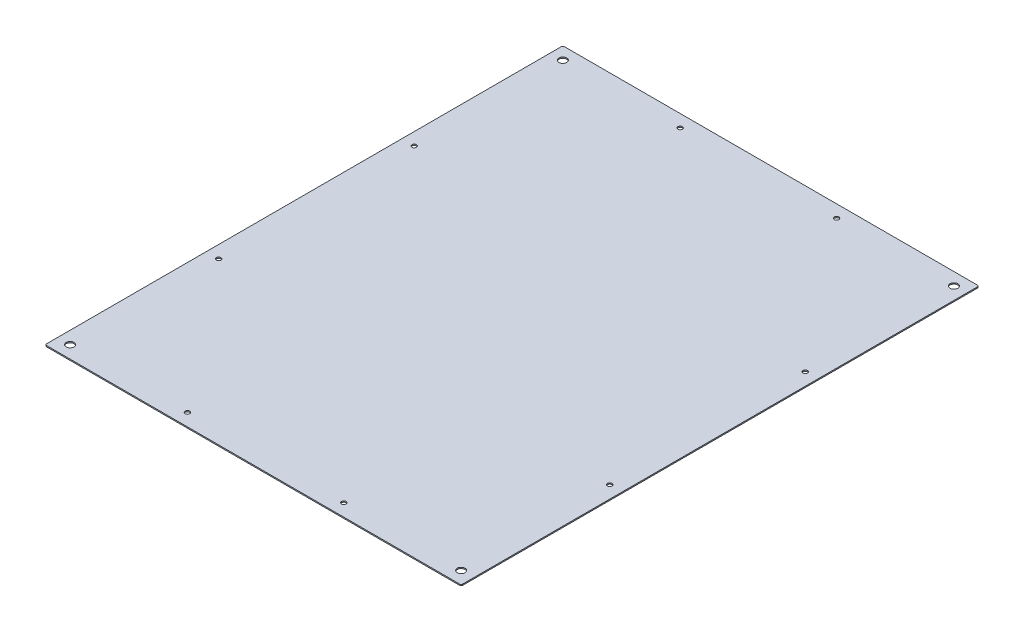
ISO-10303-21;
HEADER;
FILE_DESCRIPTION(('STEP AP214'),'2;1');
FILE_NAME('part.step','',(''),(''),'','','');
FILE_SCHEMA(('AUTOMOTIVE_DESIGN { 1 0 10303 214 1 1 1 1 }'));
ENDSEC;
DATA;
#1=APPLICATION_CONTEXT('core data for automotive mechanical design processes');
#2=APPLICATION_PROTOCOL_DEFINITION('international standard','automotive_design',2000,#1);
#3=PRODUCT_CONTEXT('',#1,'mechanical');
#4=PRODUCT('Part','Part','',(#3));
#5=PRODUCT_RELATED_PRODUCT_CATEGORY('part','',(#4));
#6=PRODUCT_DEFINITION_FORMATION('','',#4);
#7=PRODUCT_DEFINITION_CONTEXT('part definition',#1,'design');
#8=PRODUCT_DEFINITION('design','',#6,#7);
#9=PRODUCT_DEFINITION_SHAPE('','',#8);
#10=(LENGTH_UNIT() NAMED_UNIT(*) SI_UNIT(.MILLI.,.METRE.));
#11=(NAMED_UNIT(*) PLANE_ANGLE_UNIT() SI_UNIT($,.RADIAN.));
#12=(NAMED_UNIT(*) SI_UNIT($,.STERADIAN.) SOLID_ANGLE_UNIT());
#13=UNCERTAINTY_MEASURE_WITH_UNIT(LENGTH_MEASURE(1.E-05),#10,'distance_accuracy_value','');
#14=(GEOMETRIC_REPRESENTATION_CONTEXT(3) GLOBAL_UNCERTAINTY_ASSIGNED_CONTEXT((#13)) GLOBAL_UNIT_ASSIGNED_CONTEXT((#10,
#11,#12)) REPRESENTATION_CONTEXT('',''));
#15=CARTESIAN_POINT('',(0.,0.,0.));
#16=DIRECTION('',(0.,0.,1.));
#17=DIRECTION('',(1.,0.,0.));
#18=AXIS2_PLACEMENT_3D('',#15,#16,#17);
#19=CARTESIAN_POINT('',(266.,-1.5,331.));
#20=DIRECTION('',(0.,0.,1.));
#21=DIRECTION('',(1.,0.,0.));
#22=AXIS2_PLACEMENT_3D('',#19,#20,#21);
#23=PLANE('',#22);
#24=DIRECTION('',(1.,0.,0.));
#25=VECTOR('',#24,1.);
#26=CARTESIAN_POINT('',(266.,-1.5,331.));
#27=LINE('',#26,#25);
#28=CARTESIAN_POINT('',(-264.,-1.5,331.));
#29=VERTEX_POINT('',#28);
#30=CARTESIAN_POINT('',(264.,-1.5,331.));
#31=VERTEX_POINT('',#30);
#32=EDGE_CURVE('E165',#29,#31,#27,.T.);
#33=ORIENTED_EDGE('',*,*,#32,.T.);
#34=DIRECTION('',(0.,1.,0.));
#35=VECTOR('',#34,1.);
#36=CARTESIAN_POINT('',(264.,-1.5,331.));
#37=LINE('',#36,#35);
#38=CARTESIAN_POINT('',(264.,0.,331.));
#39=VERTEX_POINT('',#38);
#40=EDGE_CURVE('E11',#31,#39,#37,.T.);
#41=ORIENTED_EDGE('',*,*,#40,.T.);
#42=DIRECTION('',(1.,0.,0.));
#43=VECTOR('',#42,1.);
#44=CARTESIAN_POINT('',(266.,0.,331.));
#45=LINE('',#44,#43);
#46=CARTESIAN_POINT('',(-264.,0.,331.));
#47=VERTEX_POINT('',#46);
#48=EDGE_CURVE('E115',#47,#39,#45,.T.);
#49=ORIENTED_EDGE('',*,*,#48,.F.);
#50=DIRECTION('',(0.,1.,0.));
#51=VECTOR('',#50,1.);
#52=CARTESIAN_POINT('',(-264.,-1.5,331.));
#53=LINE('',#52,#51);
#54=EDGE_CURVE('E51',#47,#29,#53,.F.);
#55=ORIENTED_EDGE('',*,*,#54,.T.);
#56=EDGE_LOOP('',(#33,#41,#49,#55));
#57=FACE_BOUND('',#56,.T.);
#58=ADVANCED_FACE('F43',(#57),#23,.T.);
#59=CARTESIAN_POINT('',(-266.,-1.5,-331.));
#60=DIRECTION('',(-1.,0.,0.));
#61=DIRECTION('',(0.,0.,1.));
#62=AXIS2_PLACEMENT_3D('',#59,#60,#61);
#63=PLANE('',#62);
#64=DIRECTION('',(0.,0.,1.));
#65=VECTOR('',#64,1.);
#66=CARTESIAN_POINT('',(-266.,0.,-331.));
#67=LINE('',#66,#65);
#68=CARTESIAN_POINT('',(-266.,0.,-329.));
#69=VERTEX_POINT('',#68);
#70=CARTESIAN_POINT('',(-266.,0.,329.));
#71=VERTEX_POINT('',#70);
#72=EDGE_CURVE('E141',#69,#71,#67,.T.);
#73=ORIENTED_EDGE('',*,*,#72,.F.);
#74=DIRECTION('',(0.,1.,0.));
#75=VECTOR('',#74,1.);
#76=CARTESIAN_POINT('',(-266.,-1.5,-329.));
#77=LINE('',#76,#75);
#78=CARTESIAN_POINT('',(-266.,-1.5,-329.));
#79=VERTEX_POINT('',#78);
#80=EDGE_CURVE('E65',#69,#79,#77,.F.);
#81=ORIENTED_EDGE('',*,*,#80,.T.);
#82=DIRECTION('',(0.,0.,1.));
#83=VECTOR('',#82,1.);
#84=CARTESIAN_POINT('',(-266.,-1.5,-331.));
#85=LINE('',#84,#83);
#86=CARTESIAN_POINT('',(-266.,-1.5,329.));
#87=VERTEX_POINT('',#86);
#88=EDGE_CURVE('E135',#79,#87,#85,.T.);
#89=ORIENTED_EDGE('',*,*,#88,.T.);
#90=DIRECTION('',(0.,1.,0.));
#91=VECTOR('',#90,1.);
#92=CARTESIAN_POINT('',(-266.,-1.5,329.));
#93=LINE('',#92,#91);
#94=EDGE_CURVE('E159',#87,#71,#93,.T.);
#95=ORIENTED_EDGE('',*,*,#94,.T.);
#96=EDGE_LOOP('',(#73,#81,#89,#95));
#97=FACE_BOUND('',#96,.T.);
#98=ADVANCED_FACE('F173',(#97),#63,.T.);
#99=CARTESIAN_POINT('',(266.,-1.5,-331.));
#100=DIRECTION('',(0.,0.,-1.));
#101=DIRECTION('',(-1.,0.,0.));
#102=AXIS2_PLACEMENT_3D('',#99,#100,#101);
#103=PLANE('',#102);
#104=DIRECTION('',(-1.,0.,0.));
#105=VECTOR('',#104,1.);
#106=CARTESIAN_POINT('',(266.,0.,-331.));
#107=LINE('',#106,#105);
#108=CARTESIAN_POINT('',(264.,0.,-331.));
#109=VERTEX_POINT('',#108);
#110=CARTESIAN_POINT('',(-264.,0.,-331.));
#111=VERTEX_POINT('',#110);
#112=EDGE_CURVE('E130',#109,#111,#107,.T.);
#113=ORIENTED_EDGE('',*,*,#112,.F.);
#114=DIRECTION('',(0.,1.,0.));
#115=VECTOR('',#114,1.);
#116=CARTESIAN_POINT('',(264.,-1.5,-331.));
#117=LINE('',#116,#115);
#118=CARTESIAN_POINT('',(264.,-1.5,-331.));
#119=VERTEX_POINT('',#118);
#120=EDGE_CURVE('E151',#109,#119,#117,.F.);
#121=ORIENTED_EDGE('',*,*,#120,.T.);
#122=DIRECTION('',(-1.,0.,0.));
#123=VECTOR('',#122,1.);
#124=CARTESIAN_POINT('',(266.,-1.5,-331.));
#125=LINE('',#124,#123);
#126=CARTESIAN_POINT('',(-264.,-1.5,-331.));
#127=VERTEX_POINT('',#126);
#128=EDGE_CURVE('E138',#119,#127,#125,.T.);
#129=ORIENTED_EDGE('',*,*,#128,.T.);
#130=DIRECTION('',(0.,1.,0.));
#131=VECTOR('',#130,1.);
#132=CARTESIAN_POINT('',(-264.,-1.5,-331.));
#133=LINE('',#132,#131);
#134=EDGE_CURVE('E148',#127,#111,#133,.T.);
#135=ORIENTED_EDGE('',*,*,#134,.T.);
#136=EDGE_LOOP('',(#113,#121,#129,#135));
#137=FACE_BOUND('',#136,.T.);
#138=ADVANCED_FACE('F301',(#137),#103,.T.);
#139=CARTESIAN_POINT('',(266.,-1.5,-331.));
#140=DIRECTION('',(1.,0.,0.));
#141=DIRECTION('',(0.,0.,-1.));
#142=AXIS2_PLACEMENT_3D('',#139,#140,#141);
#143=PLANE('',#142);
#144=DIRECTION('',(0.,0.,-1.));
#145=VECTOR('',#144,1.);
#146=CARTESIAN_POINT('',(266.,-1.5,-331.));
#147=LINE('',#146,#145);
#148=CARTESIAN_POINT('',(266.,-1.5,329.));
#149=VERTEX_POINT('',#148);
#150=CARTESIAN_POINT('',(266.,-1.5,-329.));
#151=VERTEX_POINT('',#150);
#152=EDGE_CURVE('E169',#149,#151,#147,.T.);
#153=ORIENTED_EDGE('',*,*,#152,.T.);
#154=DIRECTION('',(0.,1.,0.));
#155=VECTOR('',#154,1.);
#156=CARTESIAN_POINT('',(266.,-1.5,-329.));
#157=LINE('',#156,#155);
#158=CARTESIAN_POINT('',(266.,0.,-329.));
#159=VERTEX_POINT('',#158);
#160=EDGE_CURVE('E129',#151,#159,#157,.T.);
#161=ORIENTED_EDGE('',*,*,#160,.T.);
#162=DIRECTION('',(0.,0.,-1.));
#163=VECTOR('',#162,1.);
#164=CARTESIAN_POINT('',(266.,0.,-331.));
#165=LINE('',#164,#163);
#166=CARTESIAN_POINT('',(266.,0.,329.));
#167=VERTEX_POINT('',#166);
#168=EDGE_CURVE('E113',#167,#159,#165,.T.);
#169=ORIENTED_EDGE('',*,*,#168,.F.);
#170=DIRECTION('',(0.,1.,0.));
#171=VECTOR('',#170,1.);
#172=CARTESIAN_POINT('',(266.,-1.5,329.));
#173=LINE('',#172,#171);
#174=EDGE_CURVE('E126',#167,#149,#173,.F.);
#175=ORIENTED_EDGE('',*,*,#174,.T.);
#176=EDGE_LOOP('',(#153,#161,#169,#175));
#177=FACE_BOUND('',#176,.T.);
#178=ADVANCED_FACE('F125',(#177),#143,.T.);
#179=CARTESIAN_POINT('',(0.,-1.5,0.));
#180=DIRECTION('',(0.,1.,0.));
#181=DIRECTION('',(0.,0.,1.));
#182=AXIS2_PLACEMENT_3D('',#179,#180,#181);
#183=PLANE('',#182);
#184=CARTESIAN_POINT('',(-100.,-1.5,-315.));
#185=DIRECTION('',(0.,1.,0.));
#186=DIRECTION('',(0.,0.,1.));
#187=AXIS2_PLACEMENT_3D('',#184,#185,#186);
#188=CIRCLE('',#187,2.9);
#189=CARTESIAN_POINT('',(-100.,-1.5,-312.1));
#190=VERTEX_POINT('',#189);
#191=EDGE_CURVE('E247',#190,#190,#188,.T.);
#192=ORIENTED_EDGE('',*,*,#191,.T.);
#193=EDGE_LOOP('',(#192));
#194=FACE_BOUND('',#193,.T.);
#195=CARTESIAN_POINT('',(-250.,-1.5,-125.));
#196=DIRECTION('',(0.,1.,0.));
#197=DIRECTION('',(0.,0.,1.));
#198=AXIS2_PLACEMENT_3D('',#195,#196,#197);
#199=CIRCLE('',#198,2.90000000000001);
#200=CARTESIAN_POINT('',(-250.,-1.5,-122.1));
#201=VERTEX_POINT('',#200);
#202=EDGE_CURVE('E241',#201,#201,#199,.T.);
#203=ORIENTED_EDGE('',*,*,#202,.T.);
#204=EDGE_LOOP('',(#203));
#205=FACE_BOUND('',#204,.T.);
#206=CARTESIAN_POINT('',(-250.,-1.5,125.));
#207=DIRECTION('',(0.,1.,0.));
#208=DIRECTION('',(0.,0.,1.));
#209=AXIS2_PLACEMENT_3D('',#206,#207,#208);
#210=CIRCLE('',#209,2.90000000000001);
#211=CARTESIAN_POINT('',(-250.,-1.5,127.9));
#212=VERTEX_POINT('',#211);
#213=EDGE_CURVE('E235',#212,#212,#210,.T.);
#214=ORIENTED_EDGE('',*,*,#213,.T.);
#215=EDGE_LOOP('',(#214));
#216=FACE_BOUND('',#215,.T.);
#217=CARTESIAN_POINT('',(-99.9999999999999,-1.5,315.));
#218=DIRECTION('',(0.,1.,0.));
#219=DIRECTION('',(0.,0.,1.));
#220=AXIS2_PLACEMENT_3D('',#217,#218,#219);
#221=CIRCLE('',#220,2.9);
#222=CARTESIAN_POINT('',(-99.9999999999999,-1.5,317.9));
#223=VERTEX_POINT('',#222);
#224=EDGE_CURVE('E229',#223,#223,#221,.T.);
#225=ORIENTED_EDGE('',*,*,#224,.T.);
#226=EDGE_LOOP('',(#225));
#227=FACE_BOUND('',#226,.T.);
#228=CARTESIAN_POINT('',(99.9999999999999,-1.5,315.));
#229=DIRECTION('',(0.,1.,0.));
#230=DIRECTION('',(0.,0.,1.));
#231=AXIS2_PLACEMENT_3D('',#228,#229,#230);
#232=CIRCLE('',#231,2.9);
#233=CARTESIAN_POINT('',(99.9999999999999,-1.5,317.9));
#234=VERTEX_POINT('',#233);
#235=EDGE_CURVE('E223',#234,#234,#232,.T.);
#236=ORIENTED_EDGE('',*,*,#235,.T.);
#237=EDGE_LOOP('',(#236));
#238=FACE_BOUND('',#237,.T.);
#239=CARTESIAN_POINT('',(250.,-1.5,125.));
#240=DIRECTION('',(0.,1.,0.));
#241=DIRECTION('',(0.,0.,1.));
#242=AXIS2_PLACEMENT_3D('',#239,#240,#241);
#243=CIRCLE('',#242,2.90000000000001);
#244=CARTESIAN_POINT('',(250.,-1.5,127.9));
#245=VERTEX_POINT('',#244);
#246=EDGE_CURVE('E217',#245,#245,#243,.T.);
#247=ORIENTED_EDGE('',*,*,#246,.T.);
#248=EDGE_LOOP('',(#247));
#249=FACE_BOUND('',#248,.T.);
#250=CARTESIAN_POINT('',(250.,-1.5,-125.));
#251=DIRECTION('',(0.,1.,0.));
#252=DIRECTION('',(0.,0.,1.));
#253=AXIS2_PLACEMENT_3D('',#250,#251,#252);
#254=CIRCLE('',#253,2.90000000000001);
#255=CARTESIAN_POINT('',(250.,-1.5,-122.1));
#256=VERTEX_POINT('',#255);
#257=EDGE_CURVE('E211',#256,#256,#254,.T.);
#258=ORIENTED_EDGE('',*,*,#257,.T.);
#259=EDGE_LOOP('',(#258));
#260=FACE_BOUND('',#259,.T.);
#261=CARTESIAN_POINT('',(100.,-1.5,-315.));
#262=DIRECTION('',(0.,1.,0.));
#263=DIRECTION('',(0.,0.,1.));
#264=AXIS2_PLACEMENT_3D('',#261,#262,#263);
#265=CIRCLE('',#264,2.9);
#266=CARTESIAN_POINT('',(100.,-1.5,-312.1));
#267=VERTEX_POINT('',#266);
#268=EDGE_CURVE('E205',#267,#267,#265,.T.);
#269=ORIENTED_EDGE('',*,*,#268,.T.);
#270=EDGE_LOOP('',(#269));
#271=FACE_BOUND('',#270,.T.);
#272=CARTESIAN_POINT('',(-250.,-1.5,315.));
#273=DIRECTION('',(0.,1.,0.));
#274=DIRECTION('',(0.,0.,1.));
#275=AXIS2_PLACEMENT_3D('',#272,#273,#274);
#276=CIRCLE('',#275,4.99999999999999);
#277=CARTESIAN_POINT('',(-250.,-1.5,320.));
#278=VERTEX_POINT('',#277);
#279=EDGE_CURVE('E199',#278,#278,#276,.T.);
#280=ORIENTED_EDGE('',*,*,#279,.T.);
#281=EDGE_LOOP('',(#280));
#282=FACE_BOUND('',#281,.T.);
#283=CARTESIAN_POINT('',(250.,-1.5,315.));
#284=DIRECTION('',(0.,1.,0.));
#285=DIRECTION('',(0.,0.,1.));
#286=AXIS2_PLACEMENT_3D('',#283,#284,#285);
#287=CIRCLE('',#286,5.);
#288=CARTESIAN_POINT('',(250.,-1.5,320.));
#289=VERTEX_POINT('',#288);
#290=EDGE_CURVE('E193',#289,#289,#287,.T.);
#291=ORIENTED_EDGE('',*,*,#290,.T.);
#292=EDGE_LOOP('',(#291));
#293=FACE_BOUND('',#292,.T.);
#294=CARTESIAN_POINT('',(250.,-1.5,-315.));
#295=DIRECTION('',(0.,1.,0.));
#296=DIRECTION('',(0.,0.,1.));
#297=AXIS2_PLACEMENT_3D('',#294,#295,#296);
#298=CIRCLE('',#297,5.);
#299=CARTESIAN_POINT('',(250.,-1.5,-310.));
#300=VERTEX_POINT('',#299);
#301=EDGE_CURVE('E187',#300,#300,#298,.T.);
#302=ORIENTED_EDGE('',*,*,#301,.T.);
#303=EDGE_LOOP('',(#302));
#304=FACE_BOUND('',#303,.T.);
#305=CARTESIAN_POINT('',(-250.,-1.5,-315.));
#306=DIRECTION('',(0.,1.,0.));
#307=DIRECTION('',(0.,0.,1.));
#308=AXIS2_PLACEMENT_3D('',#305,#306,#307);
#309=CIRCLE('',#308,4.99999999999999);
#310=CARTESIAN_POINT('',(-250.,-1.5,-310.));
#311=VERTEX_POINT('',#310);
#312=EDGE_CURVE('E177',#311,#311,#309,.T.);
#313=ORIENTED_EDGE('',*,*,#312,.T.);
#314=EDGE_LOOP('',(#313));
#315=FACE_BOUND('',#314,.T.);
#316=ORIENTED_EDGE('',*,*,#128,.F.);
#317=CARTESIAN_POINT('',(264.,-1.5,-329.));
#318=DIRECTION('',(0.,1.,0.));
#319=DIRECTION('',(0.,0.,1.));
#320=AXIS2_PLACEMENT_3D('',#317,#318,#319);
#321=CIRCLE('',#320,2.);
#322=EDGE_CURVE('E157',#119,#151,#321,.F.);
#323=ORIENTED_EDGE('',*,*,#322,.T.);
#324=ORIENTED_EDGE('',*,*,#152,.F.);
#325=CARTESIAN_POINT('',(264.,-1.5,329.));
#326=DIRECTION('',(0.,1.,0.));
#327=DIRECTION('',(0.,0.,1.));
#328=AXIS2_PLACEMENT_3D('',#325,#326,#327);
#329=CIRCLE('',#328,2.);
#330=EDGE_CURVE('E134',#149,#31,#329,.F.);
#331=ORIENTED_EDGE('',*,*,#330,.T.);
#332=ORIENTED_EDGE('',*,*,#32,.F.);
#333=CARTESIAN_POINT('',(-264.,-1.5,329.));
#334=DIRECTION('',(0.,1.,0.));
#335=DIRECTION('',(0.,0.,1.));
#336=AXIS2_PLACEMENT_3D('',#333,#334,#335);
#337=CIRCLE('',#336,2.);
#338=EDGE_CURVE('E58',#29,#87,#337,.F.);
#339=ORIENTED_EDGE('',*,*,#338,.T.);
#340=ORIENTED_EDGE('',*,*,#88,.F.);
#341=CARTESIAN_POINT('',(-264.,-1.5,-329.));
#342=DIRECTION('',(0.,1.,0.));
#343=DIRECTION('',(0.,0.,1.));
#344=AXIS2_PLACEMENT_3D('',#341,#342,#343);
#345=CIRCLE('',#344,2.);
#346=EDGE_CURVE('E155',#79,#127,#345,.F.);
#347=ORIENTED_EDGE('',*,*,#346,.T.);
#348=EDGE_LOOP('',(#316,#323,#324,#331,#332,#339,#340,#347));
#349=FACE_BOUND('',#348,.T.);
#350=ADVANCED_FACE('F168',(#194,#205,#216,#227,#238,#249,#260,#271,#282,#293,#304,#315,#349),
#183,.F.);
#351=CARTESIAN_POINT('',(0.,0.,0.));
#352=DIRECTION('',(0.,1.,0.));
#353=DIRECTION('',(0.,0.,1.));
#354=AXIS2_PLACEMENT_3D('',#351,#352,#353);
#355=PLANE('',#354);
#356=CARTESIAN_POINT('',(-100.,0.,-315.));
#357=DIRECTION('',(0.,1.,0.));
#358=DIRECTION('',(0.,0.,1.));
#359=AXIS2_PLACEMENT_3D('',#356,#357,#358);
#360=CIRCLE('',#359,2.9);
#361=CARTESIAN_POINT('',(-100.,0.,-312.1));
#362=VERTEX_POINT('',#361);
#363=EDGE_CURVE('E250',#362,#362,#360,.T.);
#364=ORIENTED_EDGE('',*,*,#363,.F.);
#365=EDGE_LOOP('',(#364));
#366=FACE_BOUND('',#365,.T.);
#367=CARTESIAN_POINT('',(-250.,0.,-125.));
#368=DIRECTION('',(0.,1.,0.));
#369=DIRECTION('',(0.,0.,1.));
#370=AXIS2_PLACEMENT_3D('',#367,#368,#369);
#371=CIRCLE('',#370,2.90000000000001);
#372=CARTESIAN_POINT('',(-250.,0.,-122.1));
#373=VERTEX_POINT('',#372);
#374=EDGE_CURVE('E244',#373,#373,#371,.T.);
#375=ORIENTED_EDGE('',*,*,#374,.F.);
#376=EDGE_LOOP('',(#375));
#377=FACE_BOUND('',#376,.T.);
#378=CARTESIAN_POINT('',(-250.,0.,125.));
#379=DIRECTION('',(0.,1.,0.));
#380=DIRECTION('',(0.,0.,1.));
#381=AXIS2_PLACEMENT_3D('',#378,#379,#380);
#382=CIRCLE('',#381,2.90000000000001);
#383=CARTESIAN_POINT('',(-250.,0.,127.9));
#384=VERTEX_POINT('',#383);
#385=EDGE_CURVE('E238',#384,#384,#382,.T.);
#386=ORIENTED_EDGE('',*,*,#385,.F.);
#387=EDGE_LOOP('',(#386));
#388=FACE_BOUND('',#387,.T.);
#389=CARTESIAN_POINT('',(-99.9999999999999,0.,315.));
#390=DIRECTION('',(0.,1.,0.));
#391=DIRECTION('',(0.,0.,1.));
#392=AXIS2_PLACEMENT_3D('',#389,#390,#391);
#393=CIRCLE('',#392,2.9);
#394=CARTESIAN_POINT('',(-99.9999999999999,0.,317.9));
#395=VERTEX_POINT('',#394);
#396=EDGE_CURVE('E232',#395,#395,#393,.T.);
#397=ORIENTED_EDGE('',*,*,#396,.F.);
#398=EDGE_LOOP('',(#397));
#399=FACE_BOUND('',#398,.T.);
#400=CARTESIAN_POINT('',(99.9999999999999,0.,315.));
#401=DIRECTION('',(0.,1.,0.));
#402=DIRECTION('',(0.,0.,1.));
#403=AXIS2_PLACEMENT_3D('',#400,#401,#402);
#404=CIRCLE('',#403,2.9);
#405=CARTESIAN_POINT('',(99.9999999999999,0.,317.9));
#406=VERTEX_POINT('',#405);
#407=EDGE_CURVE('E226',#406,#406,#404,.T.);
#408=ORIENTED_EDGE('',*,*,#407,.F.);
#409=EDGE_LOOP('',(#408));
#410=FACE_BOUND('',#409,.T.);
#411=CARTESIAN_POINT('',(250.,0.,125.));
#412=DIRECTION('',(0.,1.,0.));
#413=DIRECTION('',(0.,0.,1.));
#414=AXIS2_PLACEMENT_3D('',#411,#412,#413);
#415=CIRCLE('',#414,2.90000000000001);
#416=CARTESIAN_POINT('',(250.,0.,127.9));
#417=VERTEX_POINT('',#416);
#418=EDGE_CURVE('E220',#417,#417,#415,.T.);
#419=ORIENTED_EDGE('',*,*,#418,.F.);
#420=EDGE_LOOP('',(#419));
#421=FACE_BOUND('',#420,.T.);
#422=CARTESIAN_POINT('',(250.,0.,-125.));
#423=DIRECTION('',(0.,1.,0.));
#424=DIRECTION('',(0.,0.,1.));
#425=AXIS2_PLACEMENT_3D('',#422,#423,#424);
#426=CIRCLE('',#425,2.90000000000001);
#427=CARTESIAN_POINT('',(250.,0.,-122.1));
#428=VERTEX_POINT('',#427);
#429=EDGE_CURVE('E214',#428,#428,#426,.T.);
#430=ORIENTED_EDGE('',*,*,#429,.F.);
#431=EDGE_LOOP('',(#430));
#432=FACE_BOUND('',#431,.T.);
#433=CARTESIAN_POINT('',(100.,0.,-315.));
#434=DIRECTION('',(0.,1.,0.));
#435=DIRECTION('',(0.,0.,1.));
#436=AXIS2_PLACEMENT_3D('',#433,#434,#435);
#437=CIRCLE('',#436,2.9);
#438=CARTESIAN_POINT('',(100.,0.,-312.1));
#439=VERTEX_POINT('',#438);
#440=EDGE_CURVE('E208',#439,#439,#437,.T.);
#441=ORIENTED_EDGE('',*,*,#440,.F.);
#442=EDGE_LOOP('',(#441));
#443=FACE_BOUND('',#442,.T.);
#444=CARTESIAN_POINT('',(-250.,0.,315.));
#445=DIRECTION('',(0.,1.,0.));
#446=DIRECTION('',(0.,0.,1.));
#447=AXIS2_PLACEMENT_3D('',#444,#445,#446);
#448=CIRCLE('',#447,4.99999999999998);
#449=CARTESIAN_POINT('',(-250.,0.,320.));
#450=VERTEX_POINT('',#449);
#451=EDGE_CURVE('E202',#450,#450,#448,.T.);
#452=ORIENTED_EDGE('',*,*,#451,.F.);
#453=EDGE_LOOP('',(#452));
#454=FACE_BOUND('',#453,.T.);
#455=CARTESIAN_POINT('',(250.,0.,315.));
#456=DIRECTION('',(0.,1.,0.));
#457=DIRECTION('',(0.,0.,1.));
#458=AXIS2_PLACEMENT_3D('',#455,#456,#457);
#459=CIRCLE('',#458,5.);
#460=CARTESIAN_POINT('',(250.,0.,320.));
#461=VERTEX_POINT('',#460);
#462=EDGE_CURVE('E196',#461,#461,#459,.T.);
#463=ORIENTED_EDGE('',*,*,#462,.F.);
#464=EDGE_LOOP('',(#463));
#465=FACE_BOUND('',#464,.T.);
#466=CARTESIAN_POINT('',(250.,0.,-315.));
#467=DIRECTION('',(0.,1.,0.));
#468=DIRECTION('',(0.,0.,1.));
#469=AXIS2_PLACEMENT_3D('',#466,#467,#468);
#470=CIRCLE('',#469,5.);
#471=CARTESIAN_POINT('',(250.,0.,-310.));
#472=VERTEX_POINT('',#471);
#473=EDGE_CURVE('E190',#472,#472,#470,.T.);
#474=ORIENTED_EDGE('',*,*,#473,.F.);
#475=EDGE_LOOP('',(#474));
#476=FACE_BOUND('',#475,.T.);
#477=CARTESIAN_POINT('',(-250.,0.,-315.));
#478=DIRECTION('',(0.,1.,0.));
#479=DIRECTION('',(0.,0.,1.));
#480=AXIS2_PLACEMENT_3D('',#477,#478,#479);
#481=CIRCLE('',#480,4.99999999999998);
#482=CARTESIAN_POINT('',(-250.,0.,-310.));
#483=VERTEX_POINT('',#482);
#484=EDGE_CURVE('E184',#483,#483,#481,.T.);
#485=ORIENTED_EDGE('',*,*,#484,.F.);
#486=EDGE_LOOP('',(#485));
#487=FACE_BOUND('',#486,.T.);
#488=ORIENTED_EDGE('',*,*,#168,.T.);
#489=CARTESIAN_POINT('',(264.,0.,-329.));
#490=DIRECTION('',(0.,1.,0.));
#491=DIRECTION('',(0.,0.,1.));
#492=AXIS2_PLACEMENT_3D('',#489,#490,#491);
#493=CIRCLE('',#492,2.);
#494=EDGE_CURVE('E146',#159,#109,#493,.T.);
#495=ORIENTED_EDGE('',*,*,#494,.T.);
#496=ORIENTED_EDGE('',*,*,#112,.T.);
#497=CARTESIAN_POINT('',(-264.,0.,-329.));
#498=DIRECTION('',(0.,1.,0.));
#499=DIRECTION('',(0.,0.,1.));
#500=AXIS2_PLACEMENT_3D('',#497,#498,#499);
#501=CIRCLE('',#500,2.);
#502=EDGE_CURVE('E119',#111,#69,#501,.T.);
#503=ORIENTED_EDGE('',*,*,#502,.T.);
#504=ORIENTED_EDGE('',*,*,#72,.T.);
#505=CARTESIAN_POINT('',(-264.,0.,329.));
#506=DIRECTION('',(0.,1.,0.));
#507=DIRECTION('',(0.,0.,1.));
#508=AXIS2_PLACEMENT_3D('',#505,#506,#507);
#509=CIRCLE('',#508,2.);
#510=EDGE_CURVE('E120',#71,#47,#509,.T.);
#511=ORIENTED_EDGE('',*,*,#510,.T.);
#512=ORIENTED_EDGE('',*,*,#48,.T.);
#513=CARTESIAN_POINT('',(264.,0.,329.));
#514=DIRECTION('',(0.,1.,0.));
#515=DIRECTION('',(0.,0.,1.));
#516=AXIS2_PLACEMENT_3D('',#513,#514,#515);
#517=CIRCLE('',#516,2.);
#518=EDGE_CURVE('E110',#39,#167,#517,.T.);
#519=ORIENTED_EDGE('',*,*,#518,.T.);
#520=EDGE_LOOP('',(#488,#495,#496,#503,#504,#511,#512,#519));
#521=FACE_BOUND('',#520,.T.);
#522=ADVANCED_FACE('F112',(#366,#377,#388,#399,#410,#421,#432,#443,#454,#465,#476,#487,#521),
#355,.T.);
#523=CARTESIAN_POINT('',(264.,-1.5,-329.));
#524=DIRECTION('',(0.,1.,0.));
#525=DIRECTION('',(0.,0.,1.));
#526=AXIS2_PLACEMENT_3D('',#523,#524,#525);
#527=CYLINDRICAL_SURFACE('',#526,2.);
#528=ORIENTED_EDGE('',*,*,#322,.F.);
#529=ORIENTED_EDGE('',*,*,#120,.F.);
#530=ORIENTED_EDGE('',*,*,#494,.F.);
#531=ORIENTED_EDGE('',*,*,#160,.F.);
#532=EDGE_LOOP('',(#528,#529,#530,#531));
#533=FACE_BOUND('',#532,.T.);
#534=ADVANCED_FACE('F258',(#533),#527,.T.);
#535=CARTESIAN_POINT('',(-264.,-1.5,-329.));
#536=DIRECTION('',(0.,1.,0.));
#537=DIRECTION('',(0.,0.,1.));
#538=AXIS2_PLACEMENT_3D('',#535,#536,#537);
#539=CYLINDRICAL_SURFACE('',#538,2.);
#540=ORIENTED_EDGE('',*,*,#346,.F.);
#541=ORIENTED_EDGE('',*,*,#80,.F.);
#542=ORIENTED_EDGE('',*,*,#502,.F.);
#543=ORIENTED_EDGE('',*,*,#134,.F.);
#544=EDGE_LOOP('',(#540,#541,#542,#543));
#545=FACE_BOUND('',#544,.T.);
#546=ADVANCED_FACE('F308',(#545),#539,.T.);
#547=CARTESIAN_POINT('',(264.,-1.5,329.));
#548=DIRECTION('',(0.,1.,0.));
#549=DIRECTION('',(0.,0.,1.));
#550=AXIS2_PLACEMENT_3D('',#547,#548,#549);
#551=CYLINDRICAL_SURFACE('',#550,2.);
#552=ORIENTED_EDGE('',*,*,#330,.F.);
#553=ORIENTED_EDGE('',*,*,#174,.F.);
#554=ORIENTED_EDGE('',*,*,#518,.F.);
#555=ORIENTED_EDGE('',*,*,#40,.F.);
#556=EDGE_LOOP('',(#552,#553,#554,#555));
#557=FACE_BOUND('',#556,.T.);
#558=ADVANCED_FACE('F133',(#557),#551,.T.);
#559=CARTESIAN_POINT('',(-264.,-1.5,329.));
#560=DIRECTION('',(0.,1.,0.));
#561=DIRECTION('',(0.,0.,1.));
#562=AXIS2_PLACEMENT_3D('',#559,#560,#561);
#563=CYLINDRICAL_SURFACE('',#562,2.);
#564=ORIENTED_EDGE('',*,*,#338,.F.);
#565=ORIENTED_EDGE('',*,*,#54,.F.);
#566=ORIENTED_EDGE('',*,*,#510,.F.);
#567=ORIENTED_EDGE('',*,*,#94,.F.);
#568=EDGE_LOOP('',(#564,#565,#566,#567));
#569=FACE_BOUND('',#568,.T.);
#570=ADVANCED_FACE('F45',(#569),#563,.T.);
#571=CARTESIAN_POINT('',(-250.,0.,-315.));
#572=DIRECTION('',(0.,1.,0.));
#573=DIRECTION('',(0.,0.,1.));
#574=AXIS2_PLACEMENT_3D('',#571,#572,#573);
#575=CYLINDRICAL_SURFACE('',#574,4.99999999999999);
#576=ORIENTED_EDGE('',*,*,#312,.F.);
#577=EDGE_LOOP('',(#576));
#578=FACE_BOUND('',#577,.T.);
#579=ORIENTED_EDGE('',*,*,#484,.T.);
#580=EDGE_LOOP('',(#579));
#581=FACE_BOUND('',#580,.T.);
#582=ADVANCED_FACE('F282',(#578,#581),#575,.F.);
#583=CARTESIAN_POINT('',(250.,0.,-315.));
#584=DIRECTION('',(0.,1.,0.));
#585=DIRECTION('',(0.,0.,1.));
#586=AXIS2_PLACEMENT_3D('',#583,#584,#585);
#587=CYLINDRICAL_SURFACE('',#586,5.);
#588=ORIENTED_EDGE('',*,*,#301,.F.);
#589=EDGE_LOOP('',(#588));
#590=FACE_BOUND('',#589,.T.);
#591=ORIENTED_EDGE('',*,*,#473,.T.);
#592=EDGE_LOOP('',(#591));
#593=FACE_BOUND('',#592,.T.);
#594=ADVANCED_FACE('F284',(#590,#593),#587,.F.);
#595=CARTESIAN_POINT('',(250.,0.,315.));
#596=DIRECTION('',(0.,1.,0.));
#597=DIRECTION('',(0.,0.,1.));
#598=AXIS2_PLACEMENT_3D('',#595,#596,#597);
#599=CYLINDRICAL_SURFACE('',#598,5.);
#600=ORIENTED_EDGE('',*,*,#290,.F.);
#601=EDGE_LOOP('',(#600));
#602=FACE_BOUND('',#601,.T.);
#603=ORIENTED_EDGE('',*,*,#462,.T.);
#604=EDGE_LOOP('',(#603));
#605=FACE_BOUND('',#604,.T.);
#606=ADVANCED_FACE('F291',(#602,#605),#599,.F.);
#607=CARTESIAN_POINT('',(-250.,0.,315.));
#608=DIRECTION('',(0.,1.,0.));
#609=DIRECTION('',(0.,0.,1.));
#610=AXIS2_PLACEMENT_3D('',#607,#608,#609);
#611=CYLINDRICAL_SURFACE('',#610,4.99999999999999);
#612=ORIENTED_EDGE('',*,*,#279,.F.);
#613=EDGE_LOOP('',(#612));
#614=FACE_BOUND('',#613,.T.);
#615=ORIENTED_EDGE('',*,*,#451,.T.);
#616=EDGE_LOOP('',(#615));
#617=FACE_BOUND('',#616,.T.);
#618=ADVANCED_FACE('F343',(#614,#617),#611,.F.);
#619=CARTESIAN_POINT('',(100.,0.,-315.));
#620=DIRECTION('',(0.,1.,0.));
#621=DIRECTION('',(0.,0.,1.));
#622=AXIS2_PLACEMENT_3D('',#619,#620,#621);
#623=CYLINDRICAL_SURFACE('',#622,2.9);
#624=ORIENTED_EDGE('',*,*,#268,.F.);
#625=EDGE_LOOP('',(#624));
#626=FACE_BOUND('',#625,.T.);
#627=ORIENTED_EDGE('',*,*,#440,.T.);
#628=EDGE_LOOP('',(#627));
#629=FACE_BOUND('',#628,.T.);
#630=ADVANCED_FACE('F354',(#626,#629),#623,.F.);
#631=CARTESIAN_POINT('',(250.,0.,-125.));
#632=DIRECTION('',(0.,1.,0.));
#633=DIRECTION('',(0.,0.,1.));
#634=AXIS2_PLACEMENT_3D('',#631,#632,#633);
#635=CYLINDRICAL_SURFACE('',#634,2.90000000000001);
#636=ORIENTED_EDGE('',*,*,#257,.F.);
#637=EDGE_LOOP('',(#636));
#638=FACE_BOUND('',#637,.T.);
#639=ORIENTED_EDGE('',*,*,#429,.T.);
#640=EDGE_LOOP('',(#639));
#641=FACE_BOUND('',#640,.T.);
#642=ADVANCED_FACE('F384',(#638,#641),#635,.F.);
#643=CARTESIAN_POINT('',(250.,0.,125.));
#644=DIRECTION('',(0.,1.,0.));
#645=DIRECTION('',(0.,0.,1.));
#646=AXIS2_PLACEMENT_3D('',#643,#644,#645);
#647=CYLINDRICAL_SURFACE('',#646,2.90000000000001);
#648=ORIENTED_EDGE('',*,*,#246,.F.);
#649=EDGE_LOOP('',(#648));
#650=FACE_BOUND('',#649,.T.);
#651=ORIENTED_EDGE('',*,*,#418,.T.);
#652=EDGE_LOOP('',(#651));
#653=FACE_BOUND('',#652,.T.);
#654=ADVANCED_FACE('F395',(#650,#653),#647,.F.);
#655=CARTESIAN_POINT('',(99.9999999999999,0.,315.));
#656=DIRECTION('',(0.,1.,0.));
#657=DIRECTION('',(0.,0.,1.));
#658=AXIS2_PLACEMENT_3D('',#655,#656,#657);
#659=CYLINDRICAL_SURFACE('',#658,2.9);
#660=ORIENTED_EDGE('',*,*,#235,.F.);
#661=EDGE_LOOP('',(#660));
#662=FACE_BOUND('',#661,.T.);
#663=ORIENTED_EDGE('',*,*,#407,.T.);
#664=EDGE_LOOP('',(#663));
#665=FACE_BOUND('',#664,.T.);
#666=ADVANCED_FACE('F406',(#662,#665),#659,.F.);
#667=CARTESIAN_POINT('',(-99.9999999999999,0.,315.));
#668=DIRECTION('',(0.,1.,0.));
#669=DIRECTION('',(0.,0.,1.));
#670=AXIS2_PLACEMENT_3D('',#667,#668,#669);
#671=CYLINDRICAL_SURFACE('',#670,2.9);
#672=ORIENTED_EDGE('',*,*,#224,.F.);
#673=EDGE_LOOP('',(#672));
#674=FACE_BOUND('',#673,.T.);
#675=ORIENTED_EDGE('',*,*,#396,.T.);
#676=EDGE_LOOP('',(#675));
#677=FACE_BOUND('',#676,.T.);
#678=ADVANCED_FACE('F417',(#674,#677),#671,.F.);
#679=CARTESIAN_POINT('',(-250.,0.,125.));
#680=DIRECTION('',(0.,1.,0.));
#681=DIRECTION('',(0.,0.,1.));
#682=AXIS2_PLACEMENT_3D('',#679,#680,#681);
#683=CYLINDRICAL_SURFACE('',#682,2.90000000000001);
#684=ORIENTED_EDGE('',*,*,#213,.F.);
#685=EDGE_LOOP('',(#684));
#686=FACE_BOUND('',#685,.T.);
#687=ORIENTED_EDGE('',*,*,#385,.T.);
#688=EDGE_LOOP('',(#687));
#689=FACE_BOUND('',#688,.T.);
#690=ADVANCED_FACE('F428',(#686,#689),#683,.F.);
#691=CARTESIAN_POINT('',(-250.,0.,-125.));
#692=DIRECTION('',(0.,1.,0.));
#693=DIRECTION('',(0.,0.,1.));
#694=AXIS2_PLACEMENT_3D('',#691,#692,#693);
#695=CYLINDRICAL_SURFACE('',#694,2.90000000000001);
#696=ORIENTED_EDGE('',*,*,#202,.F.);
#697=EDGE_LOOP('',(#696));
#698=FACE_BOUND('',#697,.T.);
#699=ORIENTED_EDGE('',*,*,#374,.T.);
#700=EDGE_LOOP('',(#699));
#701=FACE_BOUND('',#700,.T.);
#702=ADVANCED_FACE('F439',(#698,#701),#695,.F.);
#703=CARTESIAN_POINT('',(-100.,0.,-315.));
#704=DIRECTION('',(0.,1.,0.));
#705=DIRECTION('',(0.,0.,1.));
#706=AXIS2_PLACEMENT_3D('',#703,#704,#705);
#707=CYLINDRICAL_SURFACE('',#706,2.9);
#708=ORIENTED_EDGE('',*,*,#191,.F.);
#709=EDGE_LOOP('',(#708));
#710=FACE_BOUND('',#709,.T.);
#711=ORIENTED_EDGE('',*,*,#363,.T.);
#712=EDGE_LOOP('',(#711));
#713=FACE_BOUND('',#712,.T.);
#714=ADVANCED_FACE('F254',(#710,#713),#707,.F.);
#715=CLOSED_SHELL('',(#58,#98,#138,#178,#350,#522,#534,#546,#558,#570,#582,#594,#606,#618,#630,
#642,#654,#666,#678,#690,#702,#714));
#716=MANIFOLD_SOLID_BREP('B2',#715);
#717=ADVANCED_BREP_SHAPE_REPRESENTATION('',(#18,#716),#14);
#718=SHAPE_DEFINITION_REPRESENTATION(#9,#717);
ENDSEC;
END-ISO-10303-21;
